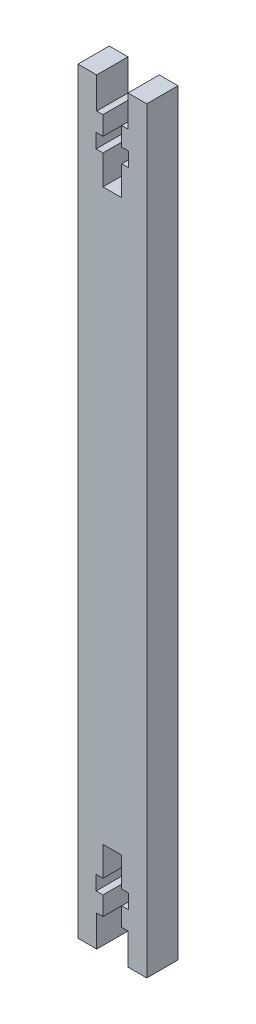
ISO-10303-21;
HEADER;
FILE_DESCRIPTION(('STEP AP214'),'2;1');
FILE_NAME('part.step','',(''),(''),'','','');
FILE_SCHEMA(('AUTOMOTIVE_DESIGN { 1 0 10303 214 1 1 1 1 }'));
ENDSEC;
DATA;
#1=APPLICATION_CONTEXT('core data for automotive mechanical design processes');
#2=APPLICATION_PROTOCOL_DEFINITION('international standard','automotive_design',2000,#1);
#3=PRODUCT_CONTEXT('',#1,'mechanical');
#4=PRODUCT('Part','Part','',(#3));
#5=PRODUCT_RELATED_PRODUCT_CATEGORY('part','',(#4));
#6=PRODUCT_DEFINITION_FORMATION('','',#4);
#7=PRODUCT_DEFINITION_CONTEXT('part definition',#1,'design');
#8=PRODUCT_DEFINITION('design','',#6,#7);
#9=PRODUCT_DEFINITION_SHAPE('','',#8);
#10=(LENGTH_UNIT() NAMED_UNIT(*) SI_UNIT(.MILLI.,.METRE.));
#11=(NAMED_UNIT(*) PLANE_ANGLE_UNIT() SI_UNIT($,.RADIAN.));
#12=(NAMED_UNIT(*) SI_UNIT($,.STERADIAN.) SOLID_ANGLE_UNIT());
#13=UNCERTAINTY_MEASURE_WITH_UNIT(LENGTH_MEASURE(1.E-05),#10,'distance_accuracy_value','');
#14=(GEOMETRIC_REPRESENTATION_CONTEXT(3) GLOBAL_UNCERTAINTY_ASSIGNED_CONTEXT((#13)) GLOBAL_UNIT_ASSIGNED_CONTEXT((#10,
#11,#12)) REPRESENTATION_CONTEXT('',''));
#15=CARTESIAN_POINT('',(0.,0.,0.));
#16=DIRECTION('',(0.,0.,1.));
#17=DIRECTION('',(1.,0.,0.));
#18=AXIS2_PLACEMENT_3D('',#15,#16,#17);
#19=CARTESIAN_POINT('',(-20.,0.,5.));
#20=DIRECTION('',(1.,0.,0.));
#21=DIRECTION('',(0.,0.,-1.));
#22=AXIS2_PLACEMENT_3D('',#19,#20,#21);
#23=PLANE('',#22);
#24=DIRECTION('',(0.,-1.,0.));
#25=VECTOR('',#24,1.);
#26=CARTESIAN_POINT('',(-20.,0.,0.));
#27=LINE('',#26,#25);
#28=CARTESIAN_POINT('',(-20.,121.,0.));
#29=VERTEX_POINT('',#28);
#30=CARTESIAN_POINT('',(-20.,0.,0.));
#31=VERTEX_POINT('',#30);
#32=EDGE_CURVE('E169',#29,#31,#27,.T.);
#33=ORIENTED_EDGE('',*,*,#32,.T.);
#34=DIRECTION('',(0.,0.,-1.));
#35=VECTOR('',#34,1.);
#36=CARTESIAN_POINT('',(-20.,0.,5.));
#37=LINE('',#36,#35);
#38=CARTESIAN_POINT('',(-20.,0.,5.));
#39=VERTEX_POINT('',#38);
#40=EDGE_CURVE('E11',#39,#31,#37,.T.);
#41=ORIENTED_EDGE('',*,*,#40,.F.);
#42=DIRECTION('',(0.,-1.,0.));
#43=VECTOR('',#42,1.);
#44=CARTESIAN_POINT('',(-20.,121.,5.));
#45=LINE('',#44,#43);
#46=CARTESIAN_POINT('',(-20.,121.,5.));
#47=VERTEX_POINT('',#46);
#48=EDGE_CURVE('E175',#47,#39,#45,.T.);
#49=ORIENTED_EDGE('',*,*,#48,.F.);
#50=DIRECTION('',(0.,0.,-1.));
#51=VECTOR('',#50,1.);
#52=CARTESIAN_POINT('',(-20.,121.,5.));
#53=LINE('',#52,#51);
#54=EDGE_CURVE('E293',#47,#29,#53,.T.);
#55=ORIENTED_EDGE('',*,*,#54,.T.);
#56=EDGE_LOOP('',(#33,#41,#49,#55));
#57=FACE_BOUND('',#56,.T.);
#58=ADVANCED_FACE('F33',(#57),#23,.F.);
#59=CARTESIAN_POINT('',(-17.,0.,5.));
#60=DIRECTION('',(0.,1.,0.));
#61=DIRECTION('',(0.,0.,1.));
#62=AXIS2_PLACEMENT_3D('',#59,#60,#61);
#63=PLANE('',#62);
#64=DIRECTION('',(1.,0.,0.));
#65=VECTOR('',#64,1.);
#66=CARTESIAN_POINT('',(-17.,0.,0.));
#67=LINE('',#66,#65);
#68=CARTESIAN_POINT('',(-17.,0.,0.));
#69=VERTEX_POINT('',#68);
#70=EDGE_CURVE('E298',#31,#69,#67,.T.);
#71=ORIENTED_EDGE('',*,*,#70,.T.);
#72=DIRECTION('',(0.,0.,-1.));
#73=VECTOR('',#72,1.);
#74=CARTESIAN_POINT('',(-17.,0.,5.));
#75=LINE('',#74,#73);
#76=CARTESIAN_POINT('',(-17.,0.,5.));
#77=VERTEX_POINT('',#76);
#78=EDGE_CURVE('E41',#77,#69,#75,.T.);
#79=ORIENTED_EDGE('',*,*,#78,.F.);
#80=DIRECTION('',(1.,0.,0.));
#81=VECTOR('',#80,1.);
#82=CARTESIAN_POINT('',(-17.,0.,5.));
#83=LINE('',#82,#81);
#84=EDGE_CURVE('E555',#39,#77,#83,.T.);
#85=ORIENTED_EDGE('',*,*,#84,.F.);
#86=ORIENTED_EDGE('',*,*,#40,.T.);
#87=EDGE_LOOP('',(#71,#79,#85,#86));
#88=FACE_BOUND('',#87,.T.);
#89=ADVANCED_FACE('F558',(#88),#63,.F.);
#90=CARTESIAN_POINT('',(-17.,0.,5.));
#91=DIRECTION('',(-1.,0.,0.));
#92=DIRECTION('',(0.,-1.,0.));
#93=AXIS2_PLACEMENT_3D('',#90,#91,#92);
#94=PLANE('',#93);
#95=DIRECTION('',(0.,1.,0.));
#96=VECTOR('',#95,1.);
#97=CARTESIAN_POINT('',(-17.,0.,0.));
#98=LINE('',#97,#96);
#99=CARTESIAN_POINT('',(-17.,5.,0.));
#100=VERTEX_POINT('',#99);
#101=EDGE_CURVE('E300',#69,#100,#98,.T.);
#102=ORIENTED_EDGE('',*,*,#101,.T.);
#103=DIRECTION('',(0.,0.,-1.));
#104=VECTOR('',#103,1.);
#105=CARTESIAN_POINT('',(-17.,5.,5.));
#106=LINE('',#105,#104);
#107=CARTESIAN_POINT('',(-17.,5.,5.));
#108=VERTEX_POINT('',#107);
#109=EDGE_CURVE('E458',#108,#100,#106,.T.);
#110=ORIENTED_EDGE('',*,*,#109,.F.);
#111=DIRECTION('',(0.,1.,0.));
#112=VECTOR('',#111,1.);
#113=CARTESIAN_POINT('',(-17.,0.,5.));
#114=LINE('',#113,#112);
#115=EDGE_CURVE('E467',#77,#108,#114,.T.);
#116=ORIENTED_EDGE('',*,*,#115,.F.);
#117=ORIENTED_EDGE('',*,*,#78,.T.);
#118=EDGE_LOOP('',(#102,#110,#116,#117));
#119=FACE_BOUND('',#118,.T.);
#120=ADVANCED_FACE('F465',(#119),#94,.F.);
#121=CARTESIAN_POINT('',(-16.,5.,5.));
#122=DIRECTION('',(0.,1.,0.));
#123=DIRECTION('',(-1.,0.,0.));
#124=AXIS2_PLACEMENT_3D('',#121,#122,#123);
#125=PLANE('',#124);
#126=DIRECTION('',(1.,0.,0.));
#127=VECTOR('',#126,1.);
#128=CARTESIAN_POINT('',(-16.,5.,0.));
#129=LINE('',#128,#127);
#130=CARTESIAN_POINT('',(-16.,5.,0.));
#131=VERTEX_POINT('',#130);
#132=EDGE_CURVE('E302',#100,#131,#129,.T.);
#133=ORIENTED_EDGE('',*,*,#132,.T.);
#134=DIRECTION('',(0.,0.,-1.));
#135=VECTOR('',#134,1.);
#136=CARTESIAN_POINT('',(-16.,5.,5.));
#137=LINE('',#136,#135);
#138=CARTESIAN_POINT('',(-16.,5.,5.));
#139=VERTEX_POINT('',#138);
#140=EDGE_CURVE('E455',#139,#131,#137,.T.);
#141=ORIENTED_EDGE('',*,*,#140,.F.);
#142=DIRECTION('',(1.,0.,0.));
#143=VECTOR('',#142,1.);
#144=CARTESIAN_POINT('',(-16.,5.,5.));
#145=LINE('',#144,#143);
#146=EDGE_CURVE('E485',#108,#139,#145,.T.);
#147=ORIENTED_EDGE('',*,*,#146,.F.);
#148=ORIENTED_EDGE('',*,*,#109,.T.);
#149=EDGE_LOOP('',(#133,#141,#147,#148));
#150=FACE_BOUND('',#149,.T.);
#151=ADVANCED_FACE('F476',(#150),#125,.F.);
#152=CARTESIAN_POINT('',(-16.,8.,5.));
#153=DIRECTION('',(-1.,0.,0.));
#154=DIRECTION('',(0.,0.,1.));
#155=AXIS2_PLACEMENT_3D('',#152,#153,#154);
#156=PLANE('',#155);
#157=DIRECTION('',(0.,1.,0.));
#158=VECTOR('',#157,1.);
#159=CARTESIAN_POINT('',(-16.,8.,0.));
#160=LINE('',#159,#158);
#161=CARTESIAN_POINT('',(-16.,8.,0.));
#162=VERTEX_POINT('',#161);
#163=EDGE_CURVE('E304',#131,#162,#160,.T.);
#164=ORIENTED_EDGE('',*,*,#163,.T.);
#165=DIRECTION('',(0.,0.,-1.));
#166=VECTOR('',#165,1.);
#167=CARTESIAN_POINT('',(-16.,8.,5.));
#168=LINE('',#167,#166);
#169=CARTESIAN_POINT('',(-16.,8.,5.));
#170=VERTEX_POINT('',#169);
#171=EDGE_CURVE('E452',#170,#162,#168,.T.);
#172=ORIENTED_EDGE('',*,*,#171,.F.);
#173=DIRECTION('',(0.,1.,0.));
#174=VECTOR('',#173,1.);
#175=CARTESIAN_POINT('',(-16.,8.,5.));
#176=LINE('',#175,#174);
#177=EDGE_CURVE('E482',#139,#170,#176,.T.);
#178=ORIENTED_EDGE('',*,*,#177,.F.);
#179=ORIENTED_EDGE('',*,*,#140,.T.);
#180=EDGE_LOOP('',(#164,#172,#178,#179));
#181=FACE_BOUND('',#180,.T.);
#182=ADVANCED_FACE('F480',(#181),#156,.F.);
#183=CARTESIAN_POINT('',(-16.,8.,5.));
#184=DIRECTION('',(0.,-1.,0.));
#185=DIRECTION('',(0.,0.,-1.));
#186=AXIS2_PLACEMENT_3D('',#183,#184,#185);
#187=PLANE('',#186);
#188=DIRECTION('',(-1.,0.,0.));
#189=VECTOR('',#188,1.);
#190=CARTESIAN_POINT('',(-16.,8.,0.));
#191=LINE('',#190,#189);
#192=CARTESIAN_POINT('',(-17.1,8.,0.));
#193=VERTEX_POINT('',#192);
#194=EDGE_CURVE('E306',#162,#193,#191,.T.);
#195=ORIENTED_EDGE('',*,*,#194,.T.);
#196=DIRECTION('',(0.,0.,-1.));
#197=VECTOR('',#196,1.);
#198=CARTESIAN_POINT('',(-17.1,8.,5.));
#199=LINE('',#198,#197);
#200=CARTESIAN_POINT('',(-17.1,8.,5.));
#201=VERTEX_POINT('',#200);
#202=EDGE_CURVE('E449',#201,#193,#199,.T.);
#203=ORIENTED_EDGE('',*,*,#202,.F.);
#204=DIRECTION('',(-1.,0.,0.));
#205=VECTOR('',#204,1.);
#206=CARTESIAN_POINT('',(-16.,8.,5.));
#207=LINE('',#206,#205);
#208=EDGE_CURVE('E484',#170,#201,#207,.T.);
#209=ORIENTED_EDGE('',*,*,#208,.F.);
#210=ORIENTED_EDGE('',*,*,#171,.T.);
#211=EDGE_LOOP('',(#195,#203,#209,#210));
#212=FACE_BOUND('',#211,.T.);
#213=ADVANCED_FACE('F570',(#212),#187,.F.);
#214=CARTESIAN_POINT('',(-17.1,8.,5.));
#215=DIRECTION('',(-1.,0.,0.));
#216=DIRECTION('',(0.,0.,1.));
#217=AXIS2_PLACEMENT_3D('',#214,#215,#216);
#218=PLANE('',#217);
#219=DIRECTION('',(0.,1.,0.));
#220=VECTOR('',#219,1.);
#221=CARTESIAN_POINT('',(-17.1,8.,0.));
#222=LINE('',#221,#220);
#223=CARTESIAN_POINT('',(-17.1,10.3,0.));
#224=VERTEX_POINT('',#223);
#225=EDGE_CURVE('E308',#193,#224,#222,.T.);
#226=ORIENTED_EDGE('',*,*,#225,.T.);
#227=DIRECTION('',(0.,0.,-1.));
#228=VECTOR('',#227,1.);
#229=CARTESIAN_POINT('',(-17.1,10.3,5.));
#230=LINE('',#229,#228);
#231=CARTESIAN_POINT('',(-17.1,10.3,5.));
#232=VERTEX_POINT('',#231);
#233=EDGE_CURVE('E446',#232,#224,#230,.T.);
#234=ORIENTED_EDGE('',*,*,#233,.F.);
#235=DIRECTION('',(0.,1.,0.));
#236=VECTOR('',#235,1.);
#237=CARTESIAN_POINT('',(-17.1,8.,5.));
#238=LINE('',#237,#236);
#239=EDGE_CURVE('E487',#201,#232,#238,.T.);
#240=ORIENTED_EDGE('',*,*,#239,.F.);
#241=ORIENTED_EDGE('',*,*,#202,.T.);
#242=EDGE_LOOP('',(#226,#234,#240,#241));
#243=FACE_BOUND('',#242,.T.);
#244=ADVANCED_FACE('F573',(#243),#218,.F.);
#245=CARTESIAN_POINT('',(-17.1,10.3,5.));
#246=DIRECTION('',(0.,1.,0.));
#247=DIRECTION('',(0.,0.,1.));
#248=AXIS2_PLACEMENT_3D('',#245,#246,#247);
#249=PLANE('',#248);
#250=DIRECTION('',(1.,0.,0.));
#251=VECTOR('',#250,1.);
#252=CARTESIAN_POINT('',(-17.1,10.3,0.));
#253=LINE('',#252,#251);
#254=CARTESIAN_POINT('',(-16.,10.3,0.));
#255=VERTEX_POINT('',#254);
#256=EDGE_CURVE('E310',#224,#255,#253,.T.);
#257=ORIENTED_EDGE('',*,*,#256,.T.);
#258=DIRECTION('',(0.,0.,-1.));
#259=VECTOR('',#258,1.);
#260=CARTESIAN_POINT('',(-16.,10.3,5.));
#261=LINE('',#260,#259);
#262=CARTESIAN_POINT('',(-16.,10.3,5.));
#263=VERTEX_POINT('',#262);
#264=EDGE_CURVE('E443',#263,#255,#261,.T.);
#265=ORIENTED_EDGE('',*,*,#264,.F.);
#266=DIRECTION('',(1.,0.,0.));
#267=VECTOR('',#266,1.);
#268=CARTESIAN_POINT('',(-17.1,10.3,5.));
#269=LINE('',#268,#267);
#270=EDGE_CURVE('E493',#232,#263,#269,.T.);
#271=ORIENTED_EDGE('',*,*,#270,.F.);
#272=ORIENTED_EDGE('',*,*,#233,.T.);
#273=EDGE_LOOP('',(#257,#265,#271,#272));
#274=FACE_BOUND('',#273,.T.);
#275=ADVANCED_FACE('F577',(#274),#249,.F.);
#276=CARTESIAN_POINT('',(-16.,15.,5.));
#277=DIRECTION('',(-1.,0.,0.));
#278=DIRECTION('',(0.,0.,1.));
#279=AXIS2_PLACEMENT_3D('',#276,#277,#278);
#280=PLANE('',#279);
#281=DIRECTION('',(0.,1.,0.));
#282=VECTOR('',#281,1.);
#283=CARTESIAN_POINT('',(-16.,15.,0.));
#284=LINE('',#283,#282);
#285=CARTESIAN_POINT('',(-16.,15.,0.));
#286=VERTEX_POINT('',#285);
#287=EDGE_CURVE('E312',#255,#286,#284,.T.);
#288=ORIENTED_EDGE('',*,*,#287,.T.);
#289=DIRECTION('',(0.,0.,-1.));
#290=VECTOR('',#289,1.);
#291=CARTESIAN_POINT('',(-16.,15.,5.));
#292=LINE('',#291,#290);
#293=CARTESIAN_POINT('',(-16.,15.,5.));
#294=VERTEX_POINT('',#293);
#295=EDGE_CURVE('E440',#294,#286,#292,.T.);
#296=ORIENTED_EDGE('',*,*,#295,.F.);
#297=DIRECTION('',(0.,1.,0.));
#298=VECTOR('',#297,1.);
#299=CARTESIAN_POINT('',(-16.,15.,5.));
#300=LINE('',#299,#298);
#301=EDGE_CURVE('E495',#263,#294,#300,.T.);
#302=ORIENTED_EDGE('',*,*,#301,.F.);
#303=ORIENTED_EDGE('',*,*,#264,.T.);
#304=EDGE_LOOP('',(#288,#296,#302,#303));
#305=FACE_BOUND('',#304,.T.);
#306=ADVANCED_FACE('F581',(#305),#280,.F.);
#307=CARTESIAN_POINT('',(-13.,15.,5.));
#308=DIRECTION('',(0.,1.,0.));
#309=DIRECTION('',(0.,0.,1.));
#310=AXIS2_PLACEMENT_3D('',#307,#308,#309);
#311=PLANE('',#310);
#312=DIRECTION('',(1.,0.,0.));
#313=VECTOR('',#312,1.);
#314=CARTESIAN_POINT('',(-13.,15.,0.));
#315=LINE('',#314,#313);
#316=CARTESIAN_POINT('',(-13.,15.,0.));
#317=VERTEX_POINT('',#316);
#318=EDGE_CURVE('E314',#286,#317,#315,.T.);
#319=ORIENTED_EDGE('',*,*,#318,.T.);
#320=DIRECTION('',(0.,0.,-1.));
#321=VECTOR('',#320,1.);
#322=CARTESIAN_POINT('',(-13.,15.,5.));
#323=LINE('',#322,#321);
#324=CARTESIAN_POINT('',(-13.,15.,5.));
#325=VERTEX_POINT('',#324);
#326=EDGE_CURVE('E437',#325,#317,#323,.T.);
#327=ORIENTED_EDGE('',*,*,#326,.F.);
#328=DIRECTION('',(1.,0.,0.));
#329=VECTOR('',#328,1.);
#330=CARTESIAN_POINT('',(-13.,15.,5.));
#331=LINE('',#330,#329);
#332=EDGE_CURVE('E497',#294,#325,#331,.T.);
#333=ORIENTED_EDGE('',*,*,#332,.F.);
#334=ORIENTED_EDGE('',*,*,#295,.T.);
#335=EDGE_LOOP('',(#319,#327,#333,#334));
#336=FACE_BOUND('',#335,.T.);
#337=ADVANCED_FACE('F585',(#336),#311,.F.);
#338=CARTESIAN_POINT('',(-13.,10.3,5.));
#339=DIRECTION('',(1.,0.,0.));
#340=DIRECTION('',(0.,0.,-1.));
#341=AXIS2_PLACEMENT_3D('',#338,#339,#340);
#342=PLANE('',#341);
#343=DIRECTION('',(0.,-1.,0.));
#344=VECTOR('',#343,1.);
#345=CARTESIAN_POINT('',(-13.,10.3,0.));
#346=LINE('',#345,#344);
#347=CARTESIAN_POINT('',(-13.,10.3,0.));
#348=VERTEX_POINT('',#347);
#349=EDGE_CURVE('E316',#317,#348,#346,.T.);
#350=ORIENTED_EDGE('',*,*,#349,.T.);
#351=DIRECTION('',(0.,0.,-1.));
#352=VECTOR('',#351,1.);
#353=CARTESIAN_POINT('',(-13.,10.3,5.));
#354=LINE('',#353,#352);
#355=CARTESIAN_POINT('',(-13.,10.3,5.));
#356=VERTEX_POINT('',#355);
#357=EDGE_CURVE('E434',#356,#348,#354,.T.);
#358=ORIENTED_EDGE('',*,*,#357,.F.);
#359=DIRECTION('',(0.,-1.,0.));
#360=VECTOR('',#359,1.);
#361=CARTESIAN_POINT('',(-13.,10.3,5.));
#362=LINE('',#361,#360);
#363=EDGE_CURVE('E499',#325,#356,#362,.T.);
#364=ORIENTED_EDGE('',*,*,#363,.F.);
#365=ORIENTED_EDGE('',*,*,#326,.T.);
#366=EDGE_LOOP('',(#350,#358,#364,#365));
#367=FACE_BOUND('',#366,.T.);
#368=ADVANCED_FACE('F589',(#367),#342,.F.);
#369=CARTESIAN_POINT('',(-13.,10.3,5.));
#370=DIRECTION('',(0.,1.,0.));
#371=DIRECTION('',(0.,0.,1.));
#372=AXIS2_PLACEMENT_3D('',#369,#370,#371);
#373=PLANE('',#372);
#374=DIRECTION('',(1.,0.,0.));
#375=VECTOR('',#374,1.);
#376=CARTESIAN_POINT('',(-13.,10.3,0.));
#377=LINE('',#376,#375);
#378=CARTESIAN_POINT('',(-11.9,10.3,0.));
#379=VERTEX_POINT('',#378);
#380=EDGE_CURVE('E318',#348,#379,#377,.T.);
#381=ORIENTED_EDGE('',*,*,#380,.T.);
#382=DIRECTION('',(0.,0.,-1.));
#383=VECTOR('',#382,1.);
#384=CARTESIAN_POINT('',(-11.9,10.3,5.));
#385=LINE('',#384,#383);
#386=CARTESIAN_POINT('',(-11.9,10.3,5.));
#387=VERTEX_POINT('',#386);
#388=EDGE_CURVE('E431',#387,#379,#385,.T.);
#389=ORIENTED_EDGE('',*,*,#388,.F.);
#390=DIRECTION('',(1.,0.,0.));
#391=VECTOR('',#390,1.);
#392=CARTESIAN_POINT('',(-13.,10.3,5.));
#393=LINE('',#392,#391);
#394=EDGE_CURVE('E501',#356,#387,#393,.T.);
#395=ORIENTED_EDGE('',*,*,#394,.F.);
#396=ORIENTED_EDGE('',*,*,#357,.T.);
#397=EDGE_LOOP('',(#381,#389,#395,#396));
#398=FACE_BOUND('',#397,.T.);
#399=ADVANCED_FACE('F593',(#398),#373,.F.);
#400=CARTESIAN_POINT('',(-11.9,10.3,5.));
#401=DIRECTION('',(1.,0.,0.));
#402=DIRECTION('',(0.,1.,0.));
#403=AXIS2_PLACEMENT_3D('',#400,#401,#402);
#404=PLANE('',#403);
#405=DIRECTION('',(0.,-1.,0.));
#406=VECTOR('',#405,1.);
#407=CARTESIAN_POINT('',(-11.9,10.3,0.));
#408=LINE('',#407,#406);
#409=CARTESIAN_POINT('',(-11.9,8.,0.));
#410=VERTEX_POINT('',#409);
#411=EDGE_CURVE('E320',#379,#410,#408,.T.);
#412=ORIENTED_EDGE('',*,*,#411,.T.);
#413=DIRECTION('',(0.,0.,-1.));
#414=VECTOR('',#413,1.);
#415=CARTESIAN_POINT('',(-11.9,8.,5.));
#416=LINE('',#415,#414);
#417=CARTESIAN_POINT('',(-11.9,8.,5.));
#418=VERTEX_POINT('',#417);
#419=EDGE_CURVE('E428',#418,#410,#416,.T.);
#420=ORIENTED_EDGE('',*,*,#419,.F.);
#421=DIRECTION('',(0.,-1.,0.));
#422=VECTOR('',#421,1.);
#423=CARTESIAN_POINT('',(-11.9,10.3,5.));
#424=LINE('',#423,#422);
#425=EDGE_CURVE('E503',#387,#418,#424,.T.);
#426=ORIENTED_EDGE('',*,*,#425,.F.);
#427=ORIENTED_EDGE('',*,*,#388,.T.);
#428=EDGE_LOOP('',(#412,#420,#426,#427));
#429=FACE_BOUND('',#428,.T.);
#430=ADVANCED_FACE('F597',(#429),#404,.F.);
#431=CARTESIAN_POINT('',(-11.9,8.,5.));
#432=DIRECTION('',(0.,-1.,0.));
#433=DIRECTION('',(0.,0.,-1.));
#434=AXIS2_PLACEMENT_3D('',#431,#432,#433);
#435=PLANE('',#434);
#436=DIRECTION('',(-1.,0.,0.));
#437=VECTOR('',#436,1.);
#438=CARTESIAN_POINT('',(-11.9,8.,0.));
#439=LINE('',#438,#437);
#440=CARTESIAN_POINT('',(-13.,8.,0.));
#441=VERTEX_POINT('',#440);
#442=EDGE_CURVE('E322',#410,#441,#439,.T.);
#443=ORIENTED_EDGE('',*,*,#442,.T.);
#444=DIRECTION('',(0.,0.,-1.));
#445=VECTOR('',#444,1.);
#446=CARTESIAN_POINT('',(-13.,8.,5.));
#447=LINE('',#446,#445);
#448=CARTESIAN_POINT('',(-13.,8.,5.));
#449=VERTEX_POINT('',#448);
#450=EDGE_CURVE('E425',#449,#441,#447,.T.);
#451=ORIENTED_EDGE('',*,*,#450,.F.);
#452=DIRECTION('',(-1.,0.,0.));
#453=VECTOR('',#452,1.);
#454=CARTESIAN_POINT('',(-11.9,8.,5.));
#455=LINE('',#454,#453);
#456=EDGE_CURVE('E505',#418,#449,#455,.T.);
#457=ORIENTED_EDGE('',*,*,#456,.F.);
#458=ORIENTED_EDGE('',*,*,#419,.T.);
#459=EDGE_LOOP('',(#443,#451,#457,#458));
#460=FACE_BOUND('',#459,.T.);
#461=ADVANCED_FACE('F601',(#460),#435,.F.);
#462=CARTESIAN_POINT('',(-13.,5.,5.));
#463=DIRECTION('',(1.,0.,0.));
#464=DIRECTION('',(0.,0.,-1.));
#465=AXIS2_PLACEMENT_3D('',#462,#463,#464);
#466=PLANE('',#465);
#467=DIRECTION('',(0.,-1.,0.));
#468=VECTOR('',#467,1.);
#469=CARTESIAN_POINT('',(-13.,5.,0.));
#470=LINE('',#469,#468);
#471=CARTESIAN_POINT('',(-13.,5.,0.));
#472=VERTEX_POINT('',#471);
#473=EDGE_CURVE('E324',#441,#472,#470,.T.);
#474=ORIENTED_EDGE('',*,*,#473,.T.);
#475=DIRECTION('',(0.,0.,-1.));
#476=VECTOR('',#475,1.);
#477=CARTESIAN_POINT('',(-13.,5.,5.));
#478=LINE('',#477,#476);
#479=CARTESIAN_POINT('',(-13.,5.,5.));
#480=VERTEX_POINT('',#479);
#481=EDGE_CURVE('E422',#480,#472,#478,.T.);
#482=ORIENTED_EDGE('',*,*,#481,.F.);
#483=DIRECTION('',(0.,-1.,0.));
#484=VECTOR('',#483,1.);
#485=CARTESIAN_POINT('',(-13.,5.,5.));
#486=LINE('',#485,#484);
#487=EDGE_CURVE('E507',#449,#480,#486,.T.);
#488=ORIENTED_EDGE('',*,*,#487,.F.);
#489=ORIENTED_EDGE('',*,*,#450,.T.);
#490=EDGE_LOOP('',(#474,#482,#488,#489));
#491=FACE_BOUND('',#490,.T.);
#492=ADVANCED_FACE('F605',(#491),#466,.F.);
#493=CARTESIAN_POINT('',(-13.,5.,5.));
#494=DIRECTION('',(0.,1.,0.));
#495=DIRECTION('',(0.,0.,1.));
#496=AXIS2_PLACEMENT_3D('',#493,#494,#495);
#497=PLANE('',#496);
#498=DIRECTION('',(1.,0.,0.));
#499=VECTOR('',#498,1.);
#500=CARTESIAN_POINT('',(-13.,5.,0.));
#501=LINE('',#500,#499);
#502=CARTESIAN_POINT('',(-12.,5.,0.));
#503=VERTEX_POINT('',#502);
#504=EDGE_CURVE('E326',#472,#503,#501,.T.);
#505=ORIENTED_EDGE('',*,*,#504,.T.);
#506=DIRECTION('',(0.,0.,-1.));
#507=VECTOR('',#506,1.);
#508=CARTESIAN_POINT('',(-12.,5.,5.));
#509=LINE('',#508,#507);
#510=CARTESIAN_POINT('',(-12.,5.,5.));
#511=VERTEX_POINT('',#510);
#512=EDGE_CURVE('E419',#511,#503,#509,.T.);
#513=ORIENTED_EDGE('',*,*,#512,.F.);
#514=DIRECTION('',(1.,0.,0.));
#515=VECTOR('',#514,1.);
#516=CARTESIAN_POINT('',(-13.,5.,5.));
#517=LINE('',#516,#515);
#518=EDGE_CURVE('E509',#480,#511,#517,.T.);
#519=ORIENTED_EDGE('',*,*,#518,.F.);
#520=ORIENTED_EDGE('',*,*,#481,.T.);
#521=EDGE_LOOP('',(#505,#513,#519,#520));
#522=FACE_BOUND('',#521,.T.);
#523=ADVANCED_FACE('F609',(#522),#497,.F.);
#524=CARTESIAN_POINT('',(-12.,5.,5.));
#525=DIRECTION('',(1.,0.,0.));
#526=DIRECTION('',(0.,1.,0.));
#527=AXIS2_PLACEMENT_3D('',#524,#525,#526);
#528=PLANE('',#527);
#529=DIRECTION('',(0.,-1.,0.));
#530=VECTOR('',#529,1.);
#531=CARTESIAN_POINT('',(-12.,5.,0.));
#532=LINE('',#531,#530);
#533=CARTESIAN_POINT('',(-12.,0.,0.));
#534=VERTEX_POINT('',#533);
#535=EDGE_CURVE('E328',#503,#534,#532,.T.);
#536=ORIENTED_EDGE('',*,*,#535,.T.);
#537=DIRECTION('',(0.,0.,-1.));
#538=VECTOR('',#537,1.);
#539=CARTESIAN_POINT('',(-12.,0.,5.));
#540=LINE('',#539,#538);
#541=CARTESIAN_POINT('',(-12.,0.,5.));
#542=VERTEX_POINT('',#541);
#543=EDGE_CURVE('E416',#542,#534,#540,.T.);
#544=ORIENTED_EDGE('',*,*,#543,.F.);
#545=DIRECTION('',(0.,-1.,0.));
#546=VECTOR('',#545,1.);
#547=CARTESIAN_POINT('',(-12.,5.,5.));
#548=LINE('',#547,#546);
#549=EDGE_CURVE('E511',#511,#542,#548,.T.);
#550=ORIENTED_EDGE('',*,*,#549,.F.);
#551=ORIENTED_EDGE('',*,*,#512,.T.);
#552=EDGE_LOOP('',(#536,#544,#550,#551));
#553=FACE_BOUND('',#552,.T.);
#554=ADVANCED_FACE('F613',(#553),#528,.F.);
#555=CARTESIAN_POINT('',(-12.,0.,5.));
#556=DIRECTION('',(0.,1.,0.));
#557=DIRECTION('',(0.,0.,1.));
#558=AXIS2_PLACEMENT_3D('',#555,#556,#557);
#559=PLANE('',#558);
#560=DIRECTION('',(1.,0.,0.));
#561=VECTOR('',#560,1.);
#562=CARTESIAN_POINT('',(-12.,0.,0.));
#563=LINE('',#562,#561);
#564=CARTESIAN_POINT('',(-9.00000000000001,0.,0.));
#565=VERTEX_POINT('',#564);
#566=EDGE_CURVE('E330',#534,#565,#563,.T.);
#567=ORIENTED_EDGE('',*,*,#566,.T.);
#568=DIRECTION('',(0.,0.,-1.));
#569=VECTOR('',#568,1.);
#570=CARTESIAN_POINT('',(-9.00000000000001,0.,5.));
#571=LINE('',#570,#569);
#572=CARTESIAN_POINT('',(-9.00000000000001,0.,5.));
#573=VERTEX_POINT('',#572);
#574=EDGE_CURVE('E413',#573,#565,#571,.T.);
#575=ORIENTED_EDGE('',*,*,#574,.F.);
#576=DIRECTION('',(1.,0.,0.));
#577=VECTOR('',#576,1.);
#578=CARTESIAN_POINT('',(-12.,0.,5.));
#579=LINE('',#578,#577);
#580=EDGE_CURVE('E513',#542,#573,#579,.T.);
#581=ORIENTED_EDGE('',*,*,#580,.F.);
#582=ORIENTED_EDGE('',*,*,#543,.T.);
#583=EDGE_LOOP('',(#567,#575,#581,#582));
#584=FACE_BOUND('',#583,.T.);
#585=ADVANCED_FACE('F617',(#584),#559,.F.);
#586=CARTESIAN_POINT('',(-9.00000000000001,121.,5.));
#587=DIRECTION('',(-1.,0.,0.));
#588=DIRECTION('',(0.,-1.,0.));
#589=AXIS2_PLACEMENT_3D('',#586,#587,#588);
#590=PLANE('',#589);
#591=DIRECTION('',(0.,1.,0.));
#592=VECTOR('',#591,1.);
#593=CARTESIAN_POINT('',(-9.00000000000001,121.,0.));
#594=LINE('',#593,#592);
#595=CARTESIAN_POINT('',(-9.00000000000001,121.,0.));
#596=VERTEX_POINT('',#595);
#597=EDGE_CURVE('E333',#565,#596,#594,.T.);
#598=ORIENTED_EDGE('',*,*,#597,.T.);
#599=DIRECTION('',(0.,0.,-1.));
#600=VECTOR('',#599,1.);
#601=CARTESIAN_POINT('',(-9.00000000000001,121.,5.));
#602=LINE('',#601,#600);
#603=CARTESIAN_POINT('',(-9.00000000000001,121.,5.));
#604=VERTEX_POINT('',#603);
#605=EDGE_CURVE('E410',#604,#596,#602,.T.);
#606=ORIENTED_EDGE('',*,*,#605,.F.);
#607=DIRECTION('',(0.,1.,0.));
#608=VECTOR('',#607,1.);
#609=CARTESIAN_POINT('',(-9.00000000000001,0.,5.));
#610=LINE('',#609,#608);
#611=EDGE_CURVE('E515',#573,#604,#610,.T.);
#612=ORIENTED_EDGE('',*,*,#611,.F.);
#613=ORIENTED_EDGE('',*,*,#574,.T.);
#614=EDGE_LOOP('',(#598,#606,#612,#613));
#615=FACE_BOUND('',#614,.T.);
#616=ADVANCED_FACE('F621',(#615),#590,.F.);
#617=CARTESIAN_POINT('',(-12.,121.,5.));
#618=DIRECTION('',(0.,-1.,0.));
#619=DIRECTION('',(1.,0.,0.));
#620=AXIS2_PLACEMENT_3D('',#617,#618,#619);
#621=PLANE('',#620);
#622=DIRECTION('',(-1.,0.,0.));
#623=VECTOR('',#622,1.);
#624=CARTESIAN_POINT('',(-12.,121.,0.));
#625=LINE('',#624,#623);
#626=CARTESIAN_POINT('',(-12.,121.,0.));
#627=VERTEX_POINT('',#626);
#628=EDGE_CURVE('E335',#596,#627,#625,.T.);
#629=ORIENTED_EDGE('',*,*,#628,.T.);
#630=DIRECTION('',(0.,0.,-1.));
#631=VECTOR('',#630,1.);
#632=CARTESIAN_POINT('',(-12.,121.,5.));
#633=LINE('',#632,#631);
#634=CARTESIAN_POINT('',(-12.,121.,5.));
#635=VERTEX_POINT('',#634);
#636=EDGE_CURVE('E407',#635,#627,#633,.T.);
#637=ORIENTED_EDGE('',*,*,#636,.F.);
#638=DIRECTION('',(-1.,0.,0.));
#639=VECTOR('',#638,1.);
#640=CARTESIAN_POINT('',(-12.,121.,5.));
#641=LINE('',#640,#639);
#642=EDGE_CURVE('E517',#604,#635,#641,.T.);
#643=ORIENTED_EDGE('',*,*,#642,.F.);
#644=ORIENTED_EDGE('',*,*,#605,.T.);
#645=EDGE_LOOP('',(#629,#637,#643,#644));
#646=FACE_BOUND('',#645,.T.);
#647=ADVANCED_FACE('F625',(#646),#621,.F.);
#648=CARTESIAN_POINT('',(-12.,121.,5.));
#649=DIRECTION('',(1.,0.,0.));
#650=DIRECTION('',(0.,0.,-1.));
#651=AXIS2_PLACEMENT_3D('',#648,#649,#650);
#652=PLANE('',#651);
#653=DIRECTION('',(0.,-1.,0.));
#654=VECTOR('',#653,1.);
#655=CARTESIAN_POINT('',(-12.,121.,0.));
#656=LINE('',#655,#654);
#657=CARTESIAN_POINT('',(-12.,116.,0.));
#658=VERTEX_POINT('',#657);
#659=EDGE_CURVE('E337',#627,#658,#656,.T.);
#660=ORIENTED_EDGE('',*,*,#659,.T.);
#661=DIRECTION('',(0.,0.,-1.));
#662=VECTOR('',#661,1.);
#663=CARTESIAN_POINT('',(-12.,116.,5.));
#664=LINE('',#663,#662);
#665=CARTESIAN_POINT('',(-12.,116.,5.));
#666=VERTEX_POINT('',#665);
#667=EDGE_CURVE('E404',#666,#658,#664,.T.);
#668=ORIENTED_EDGE('',*,*,#667,.F.);
#669=DIRECTION('',(0.,-1.,0.));
#670=VECTOR('',#669,1.);
#671=CARTESIAN_POINT('',(-12.,121.,5.));
#672=LINE('',#671,#670);
#673=EDGE_CURVE('E519',#635,#666,#672,.T.);
#674=ORIENTED_EDGE('',*,*,#673,.F.);
#675=ORIENTED_EDGE('',*,*,#636,.T.);
#676=EDGE_LOOP('',(#660,#668,#674,#675));
#677=FACE_BOUND('',#676,.T.);
#678=ADVANCED_FACE('F629',(#677),#652,.F.);
#679=CARTESIAN_POINT('',(-13.,116.,5.));
#680=DIRECTION('',(0.,-1.,0.));
#681=DIRECTION('',(0.,0.,-1.));
#682=AXIS2_PLACEMENT_3D('',#679,#680,#681);
#683=PLANE('',#682);
#684=DIRECTION('',(-1.,0.,0.));
#685=VECTOR('',#684,1.);
#686=CARTESIAN_POINT('',(-13.,116.,0.));
#687=LINE('',#686,#685);
#688=CARTESIAN_POINT('',(-13.,116.,0.));
#689=VERTEX_POINT('',#688);
#690=EDGE_CURVE('E339',#658,#689,#687,.T.);
#691=ORIENTED_EDGE('',*,*,#690,.T.);
#692=DIRECTION('',(0.,0.,-1.));
#693=VECTOR('',#692,1.);
#694=CARTESIAN_POINT('',(-13.,116.,5.));
#695=LINE('',#694,#693);
#696=CARTESIAN_POINT('',(-13.,116.,5.));
#697=VERTEX_POINT('',#696);
#698=EDGE_CURVE('E401',#697,#689,#695,.T.);
#699=ORIENTED_EDGE('',*,*,#698,.F.);
#700=DIRECTION('',(-1.,0.,0.));
#701=VECTOR('',#700,1.);
#702=CARTESIAN_POINT('',(-13.,116.,5.));
#703=LINE('',#702,#701);
#704=EDGE_CURVE('E521',#666,#697,#703,.T.);
#705=ORIENTED_EDGE('',*,*,#704,.F.);
#706=ORIENTED_EDGE('',*,*,#667,.T.);
#707=EDGE_LOOP('',(#691,#699,#705,#706));
#708=FACE_BOUND('',#707,.T.);
#709=ADVANCED_FACE('F633',(#708),#683,.F.);
#710=CARTESIAN_POINT('',(-13.,113.,5.));
#711=DIRECTION('',(1.,0.,0.));
#712=DIRECTION('',(0.,0.,-1.));
#713=AXIS2_PLACEMENT_3D('',#710,#711,#712);
#714=PLANE('',#713);
#715=DIRECTION('',(0.,-1.,0.));
#716=VECTOR('',#715,1.);
#717=CARTESIAN_POINT('',(-13.,113.,0.));
#718=LINE('',#717,#716);
#719=CARTESIAN_POINT('',(-13.,113.,0.));
#720=VERTEX_POINT('',#719);
#721=EDGE_CURVE('E341',#689,#720,#718,.T.);
#722=ORIENTED_EDGE('',*,*,#721,.T.);
#723=DIRECTION('',(0.,0.,-1.));
#724=VECTOR('',#723,1.);
#725=CARTESIAN_POINT('',(-13.,113.,5.));
#726=LINE('',#725,#724);
#727=CARTESIAN_POINT('',(-13.,113.,5.));
#728=VERTEX_POINT('',#727);
#729=EDGE_CURVE('E398',#728,#720,#726,.T.);
#730=ORIENTED_EDGE('',*,*,#729,.F.);
#731=DIRECTION('',(0.,-1.,0.));
#732=VECTOR('',#731,1.);
#733=CARTESIAN_POINT('',(-13.,113.,5.));
#734=LINE('',#733,#732);
#735=EDGE_CURVE('E523',#697,#728,#734,.T.);
#736=ORIENTED_EDGE('',*,*,#735,.F.);
#737=ORIENTED_EDGE('',*,*,#698,.T.);
#738=EDGE_LOOP('',(#722,#730,#736,#737));
#739=FACE_BOUND('',#738,.T.);
#740=ADVANCED_FACE('F637',(#739),#714,.F.);
#741=CARTESIAN_POINT('',(-13.,113.,5.));
#742=DIRECTION('',(0.,1.,0.));
#743=DIRECTION('',(0.,0.,1.));
#744=AXIS2_PLACEMENT_3D('',#741,#742,#743);
#745=PLANE('',#744);
#746=DIRECTION('',(1.,0.,0.));
#747=VECTOR('',#746,1.);
#748=CARTESIAN_POINT('',(-13.,113.,0.));
#749=LINE('',#748,#747);
#750=CARTESIAN_POINT('',(-11.9,113.,0.));
#751=VERTEX_POINT('',#750);
#752=EDGE_CURVE('E343',#720,#751,#749,.T.);
#753=ORIENTED_EDGE('',*,*,#752,.T.);
#754=DIRECTION('',(0.,0.,-1.));
#755=VECTOR('',#754,1.);
#756=CARTESIAN_POINT('',(-11.9,113.,5.));
#757=LINE('',#756,#755);
#758=CARTESIAN_POINT('',(-11.9,113.,5.));
#759=VERTEX_POINT('',#758);
#760=EDGE_CURVE('E395',#759,#751,#757,.T.);
#761=ORIENTED_EDGE('',*,*,#760,.F.);
#762=DIRECTION('',(1.,0.,0.));
#763=VECTOR('',#762,1.);
#764=CARTESIAN_POINT('',(-13.,113.,5.));
#765=LINE('',#764,#763);
#766=EDGE_CURVE('E525',#728,#759,#765,.T.);
#767=ORIENTED_EDGE('',*,*,#766,.F.);
#768=ORIENTED_EDGE('',*,*,#729,.T.);
#769=EDGE_LOOP('',(#753,#761,#767,#768));
#770=FACE_BOUND('',#769,.T.);
#771=ADVANCED_FACE('F641',(#770),#745,.F.);
#772=CARTESIAN_POINT('',(-11.9,113.,5.));
#773=DIRECTION('',(1.,0.,0.));
#774=DIRECTION('',(0.,0.,-1.));
#775=AXIS2_PLACEMENT_3D('',#772,#773,#774);
#776=PLANE('',#775);
#777=DIRECTION('',(0.,-1.,0.));
#778=VECTOR('',#777,1.);
#779=CARTESIAN_POINT('',(-11.9,113.,0.));
#780=LINE('',#779,#778);
#781=CARTESIAN_POINT('',(-11.9,110.7,0.));
#782=VERTEX_POINT('',#781);
#783=EDGE_CURVE('E345',#751,#782,#780,.T.);
#784=ORIENTED_EDGE('',*,*,#783,.T.);
#785=DIRECTION('',(0.,0.,-1.));
#786=VECTOR('',#785,1.);
#787=CARTESIAN_POINT('',(-11.9,110.7,5.));
#788=LINE('',#787,#786);
#789=CARTESIAN_POINT('',(-11.9,110.7,5.));
#790=VERTEX_POINT('',#789);
#791=EDGE_CURVE('E392',#790,#782,#788,.T.);
#792=ORIENTED_EDGE('',*,*,#791,.F.);
#793=DIRECTION('',(0.,-1.,0.));
#794=VECTOR('',#793,1.);
#795=CARTESIAN_POINT('',(-11.9,113.,5.));
#796=LINE('',#795,#794);
#797=EDGE_CURVE('E527',#759,#790,#796,.T.);
#798=ORIENTED_EDGE('',*,*,#797,.F.);
#799=ORIENTED_EDGE('',*,*,#760,.T.);
#800=EDGE_LOOP('',(#784,#792,#798,#799));
#801=FACE_BOUND('',#800,.T.);
#802=ADVANCED_FACE('F645',(#801),#776,.F.);
#803=CARTESIAN_POINT('',(-11.9,110.7,5.));
#804=DIRECTION('',(0.,-1.,0.));
#805=DIRECTION('',(0.,0.,-1.));
#806=AXIS2_PLACEMENT_3D('',#803,#804,#805);
#807=PLANE('',#806);
#808=DIRECTION('',(-1.,0.,0.));
#809=VECTOR('',#808,1.);
#810=CARTESIAN_POINT('',(-11.9,110.7,0.));
#811=LINE('',#810,#809);
#812=CARTESIAN_POINT('',(-13.,110.7,0.));
#813=VERTEX_POINT('',#812);
#814=EDGE_CURVE('E347',#782,#813,#811,.T.);
#815=ORIENTED_EDGE('',*,*,#814,.T.);
#816=DIRECTION('',(0.,0.,-1.));
#817=VECTOR('',#816,1.);
#818=CARTESIAN_POINT('',(-13.,110.7,5.));
#819=LINE('',#818,#817);
#820=CARTESIAN_POINT('',(-13.,110.7,5.));
#821=VERTEX_POINT('',#820);
#822=EDGE_CURVE('E389',#821,#813,#819,.T.);
#823=ORIENTED_EDGE('',*,*,#822,.F.);
#824=DIRECTION('',(-1.,0.,0.));
#825=VECTOR('',#824,1.);
#826=CARTESIAN_POINT('',(-11.9,110.7,5.));
#827=LINE('',#826,#825);
#828=EDGE_CURVE('E529',#790,#821,#827,.T.);
#829=ORIENTED_EDGE('',*,*,#828,.F.);
#830=ORIENTED_EDGE('',*,*,#791,.T.);
#831=EDGE_LOOP('',(#815,#823,#829,#830));
#832=FACE_BOUND('',#831,.T.);
#833=ADVANCED_FACE('F649',(#832),#807,.F.);
#834=CARTESIAN_POINT('',(-13.,106.,5.));
#835=DIRECTION('',(1.,0.,0.));
#836=DIRECTION('',(0.,0.,-1.));
#837=AXIS2_PLACEMENT_3D('',#834,#835,#836);
#838=PLANE('',#837);
#839=DIRECTION('',(0.,-1.,0.));
#840=VECTOR('',#839,1.);
#841=CARTESIAN_POINT('',(-13.,106.,0.));
#842=LINE('',#841,#840);
#843=CARTESIAN_POINT('',(-13.,106.,0.));
#844=VERTEX_POINT('',#843);
#845=EDGE_CURVE('E349',#813,#844,#842,.T.);
#846=ORIENTED_EDGE('',*,*,#845,.T.);
#847=DIRECTION('',(0.,0.,-1.));
#848=VECTOR('',#847,1.);
#849=CARTESIAN_POINT('',(-13.,106.,5.));
#850=LINE('',#849,#848);
#851=CARTESIAN_POINT('',(-13.,106.,5.));
#852=VERTEX_POINT('',#851);
#853=EDGE_CURVE('E386',#852,#844,#850,.T.);
#854=ORIENTED_EDGE('',*,*,#853,.F.);
#855=DIRECTION('',(0.,-1.,0.));
#856=VECTOR('',#855,1.);
#857=CARTESIAN_POINT('',(-13.,106.,5.));
#858=LINE('',#857,#856);
#859=EDGE_CURVE('E531',#821,#852,#858,.T.);
#860=ORIENTED_EDGE('',*,*,#859,.F.);
#861=ORIENTED_EDGE('',*,*,#822,.T.);
#862=EDGE_LOOP('',(#846,#854,#860,#861));
#863=FACE_BOUND('',#862,.T.);
#864=ADVANCED_FACE('F653',(#863),#838,.F.);
#865=CARTESIAN_POINT('',(-16.,106.,5.));
#866=DIRECTION('',(0.,-1.,0.));
#867=DIRECTION('',(0.,0.,-1.));
#868=AXIS2_PLACEMENT_3D('',#865,#866,#867);
#869=PLANE('',#868);
#870=DIRECTION('',(-1.,0.,0.));
#871=VECTOR('',#870,1.);
#872=CARTESIAN_POINT('',(-16.,106.,0.));
#873=LINE('',#872,#871);
#874=CARTESIAN_POINT('',(-16.,106.,0.));
#875=VERTEX_POINT('',#874);
#876=EDGE_CURVE('E351',#844,#875,#873,.T.);
#877=ORIENTED_EDGE('',*,*,#876,.T.);
#878=DIRECTION('',(0.,0.,-1.));
#879=VECTOR('',#878,1.);
#880=CARTESIAN_POINT('',(-16.,106.,5.));
#881=LINE('',#880,#879);
#882=CARTESIAN_POINT('',(-16.,106.,5.));
#883=VERTEX_POINT('',#882);
#884=EDGE_CURVE('E383',#883,#875,#881,.T.);
#885=ORIENTED_EDGE('',*,*,#884,.F.);
#886=DIRECTION('',(-1.,0.,0.));
#887=VECTOR('',#886,1.);
#888=CARTESIAN_POINT('',(-16.,106.,5.));
#889=LINE('',#888,#887);
#890=EDGE_CURVE('E533',#852,#883,#889,.T.);
#891=ORIENTED_EDGE('',*,*,#890,.F.);
#892=ORIENTED_EDGE('',*,*,#853,.T.);
#893=EDGE_LOOP('',(#877,#885,#891,#892));
#894=FACE_BOUND('',#893,.T.);
#895=ADVANCED_FACE('F657',(#894),#869,.F.);
#896=CARTESIAN_POINT('',(-16.,110.7,5.));
#897=DIRECTION('',(-1.,0.,0.));
#898=DIRECTION('',(0.,0.,1.));
#899=AXIS2_PLACEMENT_3D('',#896,#897,#898);
#900=PLANE('',#899);
#901=DIRECTION('',(0.,1.,0.));
#902=VECTOR('',#901,1.);
#903=CARTESIAN_POINT('',(-16.,110.7,0.));
#904=LINE('',#903,#902);
#905=CARTESIAN_POINT('',(-16.,110.7,0.));
#906=VERTEX_POINT('',#905);
#907=EDGE_CURVE('E353',#875,#906,#904,.T.);
#908=ORIENTED_EDGE('',*,*,#907,.T.);
#909=DIRECTION('',(0.,0.,-1.));
#910=VECTOR('',#909,1.);
#911=CARTESIAN_POINT('',(-16.,110.7,5.));
#912=LINE('',#911,#910);
#913=CARTESIAN_POINT('',(-16.,110.7,5.));
#914=VERTEX_POINT('',#913);
#915=EDGE_CURVE('E380',#914,#906,#912,.T.);
#916=ORIENTED_EDGE('',*,*,#915,.F.);
#917=DIRECTION('',(0.,1.,0.));
#918=VECTOR('',#917,1.);
#919=CARTESIAN_POINT('',(-16.,110.7,5.));
#920=LINE('',#919,#918);
#921=EDGE_CURVE('E535',#883,#914,#920,.T.);
#922=ORIENTED_EDGE('',*,*,#921,.F.);
#923=ORIENTED_EDGE('',*,*,#884,.T.);
#924=EDGE_LOOP('',(#908,#916,#922,#923));
#925=FACE_BOUND('',#924,.T.);
#926=ADVANCED_FACE('F661',(#925),#900,.F.);
#927=CARTESIAN_POINT('',(-16.,110.7,5.));
#928=DIRECTION('',(0.,-1.,0.));
#929=DIRECTION('',(0.,0.,-1.));
#930=AXIS2_PLACEMENT_3D('',#927,#928,#929);
#931=PLANE('',#930);
#932=DIRECTION('',(-1.,0.,0.));
#933=VECTOR('',#932,1.);
#934=CARTESIAN_POINT('',(-16.,110.7,0.));
#935=LINE('',#934,#933);
#936=CARTESIAN_POINT('',(-17.1,110.7,0.));
#937=VERTEX_POINT('',#936);
#938=EDGE_CURVE('E355',#906,#937,#935,.T.);
#939=ORIENTED_EDGE('',*,*,#938,.T.);
#940=DIRECTION('',(0.,0.,-1.));
#941=VECTOR('',#940,1.);
#942=CARTESIAN_POINT('',(-17.1,110.7,5.));
#943=LINE('',#942,#941);
#944=CARTESIAN_POINT('',(-17.1,110.7,5.));
#945=VERTEX_POINT('',#944);
#946=EDGE_CURVE('E377',#945,#937,#943,.T.);
#947=ORIENTED_EDGE('',*,*,#946,.F.);
#948=DIRECTION('',(-1.,0.,0.));
#949=VECTOR('',#948,1.);
#950=CARTESIAN_POINT('',(-16.,110.7,5.));
#951=LINE('',#950,#949);
#952=EDGE_CURVE('E537',#914,#945,#951,.T.);
#953=ORIENTED_EDGE('',*,*,#952,.F.);
#954=ORIENTED_EDGE('',*,*,#915,.T.);
#955=EDGE_LOOP('',(#939,#947,#953,#954));
#956=FACE_BOUND('',#955,.T.);
#957=ADVANCED_FACE('F665',(#956),#931,.F.);
#958=CARTESIAN_POINT('',(-17.1,110.7,5.));
#959=DIRECTION('',(-1.,0.,0.));
#960=DIRECTION('',(0.,0.,1.));
#961=AXIS2_PLACEMENT_3D('',#958,#959,#960);
#962=PLANE('',#961);
#963=DIRECTION('',(0.,1.,0.));
#964=VECTOR('',#963,1.);
#965=CARTESIAN_POINT('',(-17.1,110.7,0.));
#966=LINE('',#965,#964);
#967=CARTESIAN_POINT('',(-17.1,113.,0.));
#968=VERTEX_POINT('',#967);
#969=EDGE_CURVE('E357',#937,#968,#966,.T.);
#970=ORIENTED_EDGE('',*,*,#969,.T.);
#971=DIRECTION('',(0.,0.,-1.));
#972=VECTOR('',#971,1.);
#973=CARTESIAN_POINT('',(-17.1,113.,5.));
#974=LINE('',#973,#972);
#975=CARTESIAN_POINT('',(-17.1,113.,5.));
#976=VERTEX_POINT('',#975);
#977=EDGE_CURVE('E374',#976,#968,#974,.T.);
#978=ORIENTED_EDGE('',*,*,#977,.F.);
#979=DIRECTION('',(0.,1.,0.));
#980=VECTOR('',#979,1.);
#981=CARTESIAN_POINT('',(-17.1,110.7,5.));
#982=LINE('',#981,#980);
#983=EDGE_CURVE('E539',#945,#976,#982,.T.);
#984=ORIENTED_EDGE('',*,*,#983,.F.);
#985=ORIENTED_EDGE('',*,*,#946,.T.);
#986=EDGE_LOOP('',(#970,#978,#984,#985));
#987=FACE_BOUND('',#986,.T.);
#988=ADVANCED_FACE('F669',(#987),#962,.F.);
#989=CARTESIAN_POINT('',(-17.1,113.,5.));
#990=DIRECTION('',(0.,1.,0.));
#991=DIRECTION('',(0.,0.,1.));
#992=AXIS2_PLACEMENT_3D('',#989,#990,#991);
#993=PLANE('',#992);
#994=DIRECTION('',(1.,0.,0.));
#995=VECTOR('',#994,1.);
#996=CARTESIAN_POINT('',(-17.1,113.,0.));
#997=LINE('',#996,#995);
#998=CARTESIAN_POINT('',(-16.,113.,0.));
#999=VERTEX_POINT('',#998);
#1000=EDGE_CURVE('E359',#968,#999,#997,.T.);
#1001=ORIENTED_EDGE('',*,*,#1000,.T.);
#1002=DIRECTION('',(0.,0.,-1.));
#1003=VECTOR('',#1002,1.);
#1004=CARTESIAN_POINT('',(-16.,113.,5.));
#1005=LINE('',#1004,#1003);
#1006=CARTESIAN_POINT('',(-16.,113.,5.));
#1007=VERTEX_POINT('',#1006);
#1008=EDGE_CURVE('E371',#1007,#999,#1005,.T.);
#1009=ORIENTED_EDGE('',*,*,#1008,.F.);
#1010=DIRECTION('',(1.,0.,0.));
#1011=VECTOR('',#1010,1.);
#1012=CARTESIAN_POINT('',(-17.1,113.,5.));
#1013=LINE('',#1012,#1011);
#1014=EDGE_CURVE('E541',#976,#1007,#1013,.T.);
#1015=ORIENTED_EDGE('',*,*,#1014,.F.);
#1016=ORIENTED_EDGE('',*,*,#977,.T.);
#1017=EDGE_LOOP('',(#1001,#1009,#1015,#1016));
#1018=FACE_BOUND('',#1017,.T.);
#1019=ADVANCED_FACE('F547',(#1018),#993,.F.);
#1020=CARTESIAN_POINT('',(-16.,116.,5.));
#1021=DIRECTION('',(-1.,0.,0.));
#1022=DIRECTION('',(0.,0.,1.));
#1023=AXIS2_PLACEMENT_3D('',#1020,#1021,#1022);
#1024=PLANE('',#1023);
#1025=DIRECTION('',(0.,1.,0.));
#1026=VECTOR('',#1025,1.);
#1027=CARTESIAN_POINT('',(-16.,116.,0.));
#1028=LINE('',#1027,#1026);
#1029=CARTESIAN_POINT('',(-16.,116.,0.));
#1030=VERTEX_POINT('',#1029);
#1031=EDGE_CURVE('E361',#999,#1030,#1028,.T.);
#1032=ORIENTED_EDGE('',*,*,#1031,.T.);
#1033=DIRECTION('',(0.,0.,-1.));
#1034=VECTOR('',#1033,1.);
#1035=CARTESIAN_POINT('',(-16.,116.,5.));
#1036=LINE('',#1035,#1034);
#1037=CARTESIAN_POINT('',(-16.,116.,5.));
#1038=VERTEX_POINT('',#1037);
#1039=EDGE_CURVE('E288',#1038,#1030,#1036,.T.);
#1040=ORIENTED_EDGE('',*,*,#1039,.F.);
#1041=DIRECTION('',(0.,1.,0.));
#1042=VECTOR('',#1041,1.);
#1043=CARTESIAN_POINT('',(-16.,116.,5.));
#1044=LINE('',#1043,#1042);
#1045=EDGE_CURVE('E279',#1007,#1038,#1044,.T.);
#1046=ORIENTED_EDGE('',*,*,#1045,.F.);
#1047=ORIENTED_EDGE('',*,*,#1008,.T.);
#1048=EDGE_LOOP('',(#1032,#1040,#1046,#1047));
#1049=FACE_BOUND('',#1048,.T.);
#1050=ADVANCED_FACE('F551',(#1049),#1024,.F.);
#1051=CARTESIAN_POINT('',(-16.,116.,5.));
#1052=DIRECTION('',(0.,-1.,0.));
#1053=DIRECTION('',(0.,0.,-1.));
#1054=AXIS2_PLACEMENT_3D('',#1051,#1052,#1053);
#1055=PLANE('',#1054);
#1056=DIRECTION('',(-1.,0.,0.));
#1057=VECTOR('',#1056,1.);
#1058=CARTESIAN_POINT('',(-16.,116.,0.));
#1059=LINE('',#1058,#1057);
#1060=CARTESIAN_POINT('',(-17.,116.,0.));
#1061=VERTEX_POINT('',#1060);
#1062=EDGE_CURVE('E287',#1030,#1061,#1059,.T.);
#1063=ORIENTED_EDGE('',*,*,#1062,.T.);
#1064=DIRECTION('',(0.,0.,-1.));
#1065=VECTOR('',#1064,1.);
#1066=CARTESIAN_POINT('',(-17.,116.,5.));
#1067=LINE('',#1066,#1065);
#1068=CARTESIAN_POINT('',(-17.,116.,5.));
#1069=VERTEX_POINT('',#1068);
#1070=EDGE_CURVE('E284',#1069,#1061,#1067,.T.);
#1071=ORIENTED_EDGE('',*,*,#1070,.F.);
#1072=DIRECTION('',(-1.,0.,0.));
#1073=VECTOR('',#1072,1.);
#1074=CARTESIAN_POINT('',(-16.,116.,5.));
#1075=LINE('',#1074,#1073);
#1076=EDGE_CURVE('E273',#1038,#1069,#1075,.T.);
#1077=ORIENTED_EDGE('',*,*,#1076,.F.);
#1078=ORIENTED_EDGE('',*,*,#1039,.T.);
#1079=EDGE_LOOP('',(#1063,#1071,#1077,#1078));
#1080=FACE_BOUND('',#1079,.T.);
#1081=ADVANCED_FACE('F285',(#1080),#1055,.F.);
#1082=CARTESIAN_POINT('',(-17.,116.,5.));
#1083=DIRECTION('',(-1.,0.,0.));
#1084=DIRECTION('',(0.,0.,1.));
#1085=AXIS2_PLACEMENT_3D('',#1082,#1083,#1084);
#1086=PLANE('',#1085);
#1087=DIRECTION('',(0.,1.,0.));
#1088=VECTOR('',#1087,1.);
#1089=CARTESIAN_POINT('',(-17.,116.,0.));
#1090=LINE('',#1089,#1088);
#1091=CARTESIAN_POINT('',(-17.,121.,0.));
#1092=VERTEX_POINT('',#1091);
#1093=EDGE_CURVE('E162',#1061,#1092,#1090,.T.);
#1094=ORIENTED_EDGE('',*,*,#1093,.T.);
#1095=DIRECTION('',(0.,0.,-1.));
#1096=VECTOR('',#1095,1.);
#1097=CARTESIAN_POINT('',(-17.,121.,5.));
#1098=LINE('',#1097,#1096);
#1099=CARTESIAN_POINT('',(-17.,121.,5.));
#1100=VERTEX_POINT('',#1099);
#1101=EDGE_CURVE('E289',#1100,#1092,#1098,.T.);
#1102=ORIENTED_EDGE('',*,*,#1101,.F.);
#1103=DIRECTION('',(0.,1.,0.));
#1104=VECTOR('',#1103,1.);
#1105=CARTESIAN_POINT('',(-17.,116.,5.));
#1106=LINE('',#1105,#1104);
#1107=EDGE_CURVE('E277',#1069,#1100,#1106,.T.);
#1108=ORIENTED_EDGE('',*,*,#1107,.F.);
#1109=ORIENTED_EDGE('',*,*,#1070,.T.);
#1110=EDGE_LOOP('',(#1094,#1102,#1108,#1109));
#1111=FACE_BOUND('',#1110,.T.);
#1112=ADVANCED_FACE('F291',(#1111),#1086,.F.);
#1113=CARTESIAN_POINT('',(-17.,121.,5.));
#1114=DIRECTION('',(0.,-1.,0.));
#1115=DIRECTION('',(1.,0.,0.));
#1116=AXIS2_PLACEMENT_3D('',#1113,#1114,#1115);
#1117=PLANE('',#1116);
#1118=DIRECTION('',(-1.,0.,0.));
#1119=VECTOR('',#1118,1.);
#1120=CARTESIAN_POINT('',(-17.,121.,0.));
#1121=LINE('',#1120,#1119);
#1122=EDGE_CURVE('E365',#1092,#29,#1121,.T.);
#1123=ORIENTED_EDGE('',*,*,#1122,.T.);
#1124=ORIENTED_EDGE('',*,*,#54,.F.);
#1125=DIRECTION('',(-1.,0.,0.));
#1126=VECTOR('',#1125,1.);
#1127=CARTESIAN_POINT('',(-17.,121.,5.));
#1128=LINE('',#1127,#1126);
#1129=EDGE_CURVE('E49',#1100,#47,#1128,.T.);
#1130=ORIENTED_EDGE('',*,*,#1129,.F.);
#1131=ORIENTED_EDGE('',*,*,#1101,.T.);
#1132=EDGE_LOOP('',(#1123,#1124,#1130,#1131));
#1133=FACE_BOUND('',#1132,.T.);
#1134=ADVANCED_FACE('F553',(#1133),#1117,.F.);
#1135=CARTESIAN_POINT('',(0.,0.,5.));
#1136=DIRECTION('',(0.,0.,-1.));
#1137=DIRECTION('',(-1.,0.,0.));
#1138=AXIS2_PLACEMENT_3D('',#1135,#1136,#1137);
#1139=PLANE('',#1138);
#1140=ORIENTED_EDGE('',*,*,#48,.T.);
#1141=ORIENTED_EDGE('',*,*,#84,.T.);
#1142=ORIENTED_EDGE('',*,*,#115,.T.);
#1143=ORIENTED_EDGE('',*,*,#146,.T.);
#1144=ORIENTED_EDGE('',*,*,#177,.T.);
#1145=ORIENTED_EDGE('',*,*,#208,.T.);
#1146=ORIENTED_EDGE('',*,*,#239,.T.);
#1147=ORIENTED_EDGE('',*,*,#270,.T.);
#1148=ORIENTED_EDGE('',*,*,#301,.T.);
#1149=ORIENTED_EDGE('',*,*,#332,.T.);
#1150=ORIENTED_EDGE('',*,*,#363,.T.);
#1151=ORIENTED_EDGE('',*,*,#394,.T.);
#1152=ORIENTED_EDGE('',*,*,#425,.T.);
#1153=ORIENTED_EDGE('',*,*,#456,.T.);
#1154=ORIENTED_EDGE('',*,*,#487,.T.);
#1155=ORIENTED_EDGE('',*,*,#518,.T.);
#1156=ORIENTED_EDGE('',*,*,#549,.T.);
#1157=ORIENTED_EDGE('',*,*,#580,.T.);
#1158=ORIENTED_EDGE('',*,*,#611,.T.);
#1159=ORIENTED_EDGE('',*,*,#642,.T.);
#1160=ORIENTED_EDGE('',*,*,#673,.T.);
#1161=ORIENTED_EDGE('',*,*,#704,.T.);
#1162=ORIENTED_EDGE('',*,*,#735,.T.);
#1163=ORIENTED_EDGE('',*,*,#766,.T.);
#1164=ORIENTED_EDGE('',*,*,#797,.T.);
#1165=ORIENTED_EDGE('',*,*,#828,.T.);
#1166=ORIENTED_EDGE('',*,*,#859,.T.);
#1167=ORIENTED_EDGE('',*,*,#890,.T.);
#1168=ORIENTED_EDGE('',*,*,#921,.T.);
#1169=ORIENTED_EDGE('',*,*,#952,.T.);
#1170=ORIENTED_EDGE('',*,*,#983,.T.);
#1171=ORIENTED_EDGE('',*,*,#1014,.T.);
#1172=ORIENTED_EDGE('',*,*,#1045,.T.);
#1173=ORIENTED_EDGE('',*,*,#1076,.T.);
#1174=ORIENTED_EDGE('',*,*,#1107,.T.);
#1175=ORIENTED_EDGE('',*,*,#1129,.T.);
#1176=EDGE_LOOP('',(#1140,#1141,#1142,#1143,#1144,#1145,#1146,#1147,#1148,#1149,#1150,#1151,
#1152,#1153,#1154,#1155,#1156,#1157,#1158,#1159,#1160,#1161,#1162,#1163,#1164,#1165,#1166,#1167,
#1168,#1169,#1170,#1171,#1172,#1173,#1174,#1175));
#1177=FACE_BOUND('',#1176,.T.);
#1178=ADVANCED_FACE('F275',(#1177),#1139,.F.);
#1179=CARTESIAN_POINT('',(0.,0.,0.));
#1180=DIRECTION('',(0.,0.,-1.));
#1181=DIRECTION('',(-1.,0.,0.));
#1182=AXIS2_PLACEMENT_3D('',#1179,#1180,#1181);
#1183=PLANE('',#1182);
#1184=ORIENTED_EDGE('',*,*,#32,.F.);
#1185=ORIENTED_EDGE('',*,*,#1122,.F.);
#1186=ORIENTED_EDGE('',*,*,#1093,.F.);
#1187=ORIENTED_EDGE('',*,*,#1062,.F.);
#1188=ORIENTED_EDGE('',*,*,#1031,.F.);
#1189=ORIENTED_EDGE('',*,*,#1000,.F.);
#1190=ORIENTED_EDGE('',*,*,#969,.F.);
#1191=ORIENTED_EDGE('',*,*,#938,.F.);
#1192=ORIENTED_EDGE('',*,*,#907,.F.);
#1193=ORIENTED_EDGE('',*,*,#876,.F.);
#1194=ORIENTED_EDGE('',*,*,#845,.F.);
#1195=ORIENTED_EDGE('',*,*,#814,.F.);
#1196=ORIENTED_EDGE('',*,*,#783,.F.);
#1197=ORIENTED_EDGE('',*,*,#752,.F.);
#1198=ORIENTED_EDGE('',*,*,#721,.F.);
#1199=ORIENTED_EDGE('',*,*,#690,.F.);
#1200=ORIENTED_EDGE('',*,*,#659,.F.);
#1201=ORIENTED_EDGE('',*,*,#628,.F.);
#1202=ORIENTED_EDGE('',*,*,#597,.F.);
#1203=ORIENTED_EDGE('',*,*,#566,.F.);
#1204=ORIENTED_EDGE('',*,*,#535,.F.);
#1205=ORIENTED_EDGE('',*,*,#504,.F.);
#1206=ORIENTED_EDGE('',*,*,#473,.F.);
#1207=ORIENTED_EDGE('',*,*,#442,.F.);
#1208=ORIENTED_EDGE('',*,*,#411,.F.);
#1209=ORIENTED_EDGE('',*,*,#380,.F.);
#1210=ORIENTED_EDGE('',*,*,#349,.F.);
#1211=ORIENTED_EDGE('',*,*,#318,.F.);
#1212=ORIENTED_EDGE('',*,*,#287,.F.);
#1213=ORIENTED_EDGE('',*,*,#256,.F.);
#1214=ORIENTED_EDGE('',*,*,#225,.F.);
#1215=ORIENTED_EDGE('',*,*,#194,.F.);
#1216=ORIENTED_EDGE('',*,*,#163,.F.);
#1217=ORIENTED_EDGE('',*,*,#132,.F.);
#1218=ORIENTED_EDGE('',*,*,#101,.F.);
#1219=ORIENTED_EDGE('',*,*,#70,.F.);
#1220=EDGE_LOOP('',(#1184,#1185,#1186,#1187,#1188,#1189,#1190,#1191,#1192,#1193,#1194,#1195,
#1196,#1197,#1198,#1199,#1200,#1201,#1202,#1203,#1204,#1205,#1206,#1207,#1208,#1209,#1210,#1211,
#1212,#1213,#1214,#1215,#1216,#1217,#1218,#1219));
#1221=FACE_BOUND('',#1220,.T.);
#1222=ADVANCED_FACE('F471',(#1221),#1183,.T.);
#1223=CLOSED_SHELL('',(#58,#89,#120,#151,#182,#213,#244,#275,#306,#337,#368,#399,#430,#461,#492,
#523,#554,#585,#616,#647,#678,#709,#740,#771,#802,#833,#864,#895,#926,#957,#988,#1019,#1050,
#1081,#1112,#1134,#1178,#1222));
#1224=MANIFOLD_SOLID_BREP('B2',#1223);
#1225=ADVANCED_BREP_SHAPE_REPRESENTATION('',(#18,#1224),#14);
#1226=SHAPE_DEFINITION_REPRESENTATION(#9,#1225);
ENDSEC;
END-ISO-10303-21;
